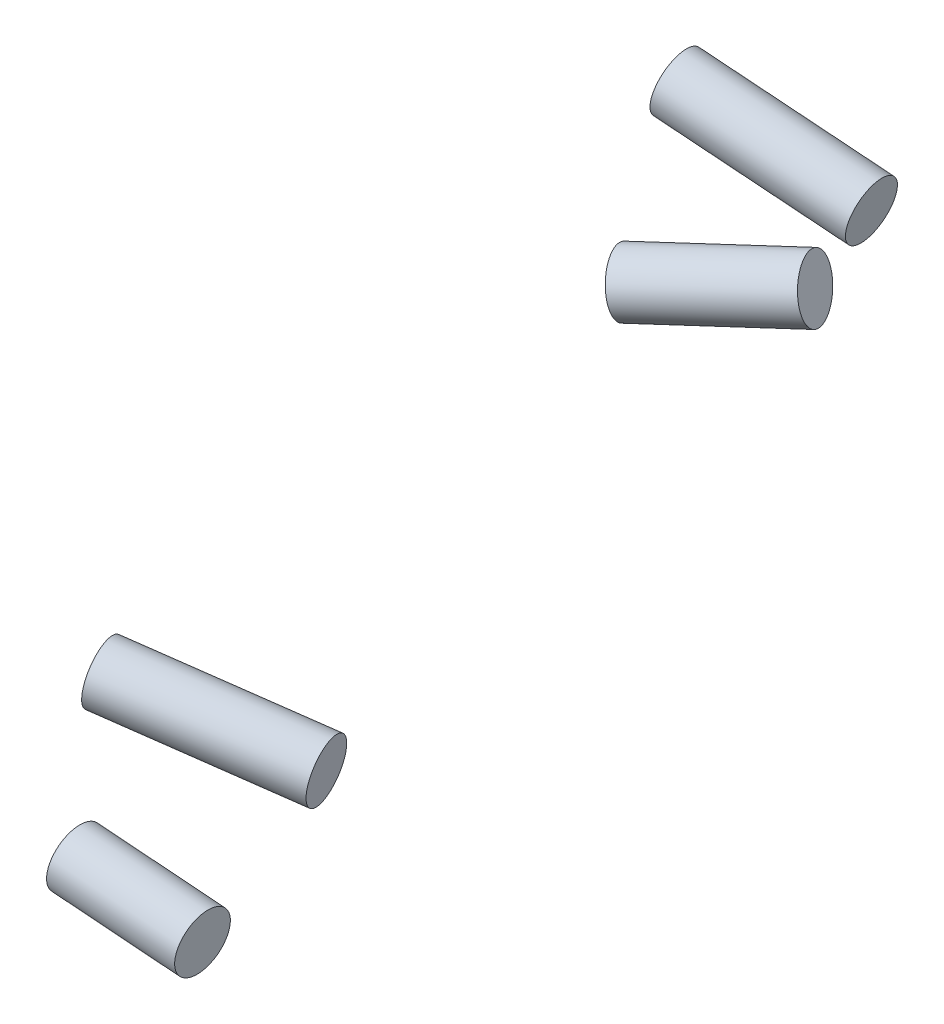
ISO-10303-21;
HEADER;
FILE_DESCRIPTION(('STEP AP214'),'2;1');
FILE_NAME('part.step','',(''),(''),'','','');
FILE_SCHEMA(('AUTOMOTIVE_DESIGN { 1 0 10303 214 1 1 1 1 }'));
ENDSEC;
DATA;
#1=APPLICATION_CONTEXT('core data for automotive mechanical design processes');
#2=APPLICATION_PROTOCOL_DEFINITION('international standard','automotive_design',2000,#1);
#3=PRODUCT_CONTEXT('',#1,'mechanical');
#4=PRODUCT('Part','Part','',(#3));
#5=PRODUCT_RELATED_PRODUCT_CATEGORY('part','',(#4));
#6=PRODUCT_DEFINITION_FORMATION('','',#4);
#7=PRODUCT_DEFINITION_CONTEXT('part definition',#1,'design');
#8=PRODUCT_DEFINITION('design','',#6,#7);
#9=PRODUCT_DEFINITION_SHAPE('','',#8);
#10=(LENGTH_UNIT() NAMED_UNIT(*) SI_UNIT(.MILLI.,.METRE.));
#11=(NAMED_UNIT(*) PLANE_ANGLE_UNIT() SI_UNIT($,.RADIAN.));
#12=(NAMED_UNIT(*) SI_UNIT($,.STERADIAN.) SOLID_ANGLE_UNIT());
#13=UNCERTAINTY_MEASURE_WITH_UNIT(LENGTH_MEASURE(1.E-05),#10,'distance_accuracy_value','');
#14=(GEOMETRIC_REPRESENTATION_CONTEXT(3) GLOBAL_UNCERTAINTY_ASSIGNED_CONTEXT((#13)) GLOBAL_UNIT_ASSIGNED_CONTEXT((#10,
#11,#12)) REPRESENTATION_CONTEXT('',''));
#15=CARTESIAN_POINT('',(0.,0.,0.));
#16=DIRECTION('',(0.,0.,1.));
#17=DIRECTION('',(1.,0.,0.));
#18=AXIS2_PLACEMENT_3D('',#15,#16,#17);
#19=CARTESIAN_POINT('',(166.026177,-30.2321009,-464.318765));
#20=DIRECTION('',(0.89786021332966,0.222717447003682,-0.379794649935699));
#21=DIRECTION('',(-0.389579708465379,0.,-0.920992752822751));
#22=AXIS2_PLACEMENT_3D('',#19,#20,#21);
#23=PLANE('',#22);
#24=CARTESIAN_POINT('',(166.026177,-30.2321009,-464.318765));
#25=DIRECTION('',(0.89786021332966,0.222717447003682,-0.379794649935699));
#26=DIRECTION('',(-0.389579708465379,0.,-0.920992752822751));
#27=AXIS2_PLACEMENT_3D('',#24,#25,#26);
#28=CIRCLE('',#27,6.99999999999999);
#29=CARTESIAN_POINT('',(163.299119040743,-30.2321009,-470.765714269759));
#30=VERTEX_POINT('',#29);
#31=EDGE_CURVE('E80',#30,#30,#28,.T.);
#32=ORIENTED_EDGE('',*,*,#31,.F.);
#33=EDGE_LOOP('',(#32));
#34=FACE_BOUND('',#33,.T.);
#35=ADVANCED_FACE('F74',(#34),#23,.F.);
#36=CARTESIAN_POINT('',(198.557411,-22.1626116,-478.079469));
#37=DIRECTION('',(0.89786021332966,0.222717447003682,-0.379794649935699));
#38=DIRECTION('',(-0.389579708465379,0.,-0.920992752822751));
#39=AXIS2_PLACEMENT_3D('',#36,#37,#38);
#40=PLANE('',#39);
#41=CARTESIAN_POINT('',(198.557411,-22.1626116,-478.079469));
#42=DIRECTION('',(0.89786021332966,0.222717447003682,-0.379794649935699));
#43=DIRECTION('',(-0.389579708465379,0.,-0.920992752822751));
#44=AXIS2_PLACEMENT_3D('',#41,#42,#43);
#45=CIRCLE('',#44,6.99999999999999);
#46=CARTESIAN_POINT('',(195.830353040742,-22.1626116,-484.526418269759));
#47=VERTEX_POINT('',#46);
#48=EDGE_CURVE('E12',#47,#47,#45,.T.);
#49=ORIENTED_EDGE('',*,*,#48,.T.);
#50=EDGE_LOOP('',(#49));
#51=FACE_BOUND('',#50,.T.);
#52=ADVANCED_FACE('F89',(#51),#40,.T.);
#53=CARTESIAN_POINT('',(166.026177,-30.2321009,-464.318765));
#54=DIRECTION('',(0.89786021332966,0.222717447003683,-0.379794649935698));
#55=DIRECTION('',(-0.389579708465379,0.,-0.920992752822752));
#56=AXIS2_PLACEMENT_3D('',#53,#54,#55);
#57=CYLINDRICAL_SURFACE('',#56,6.99999999999999);
#58=ORIENTED_EDGE('',*,*,#48,.F.);
#59=EDGE_LOOP('',(#58));
#60=FACE_BOUND('',#59,.T.);
#61=ORIENTED_EDGE('',*,*,#31,.T.);
#62=EDGE_LOOP('',(#61));
#63=FACE_BOUND('',#62,.T.);
#64=ADVANCED_FACE('F86',(#60,#63),#57,.T.);
#65=CLOSED_SHELL('',(#35,#52,#64));
#66=MANIFOLD_SOLID_BREP('B2',#65);
#67=CARTESIAN_POINT('',(164.805861,4.04738961000001,-478.324842));
#68=DIRECTION('',(0.971273965039373,-0.203382569261322,-0.123541148437916));
#69=DIRECTION('',(0.204952618983025,0.978771895781647,0.));
#70=AXIS2_PLACEMENT_3D('',#67,#68,#69);
#71=PLANE('',#70);
#72=CARTESIAN_POINT('',(164.805861,4.04738961000001,-478.324842));
#73=DIRECTION('',(0.971273965039373,-0.203382569261322,-0.123541148437916));
#74=DIRECTION('',(0.204952618983025,0.978771895781647,0.));
#75=AXIS2_PLACEMENT_3D('',#72,#73,#74);
#76=CIRCLE('',#75,7.00000000000002);
#77=CARTESIAN_POINT('',(166.240529332881,10.8987928804716,-478.324842));
#78=VERTEX_POINT('',#77);
#79=EDGE_CURVE('E141',#78,#78,#76,.T.);
#80=ORIENTED_EDGE('',*,*,#79,.F.);
#81=EDGE_LOOP('',(#80));
#82=FACE_BOUND('',#81,.T.);
#83=ADVANCED_FACE('F135',(#82),#71,.F.);
#84=CARTESIAN_POINT('',(206.559789,-4.69578837999999,-483.635731));
#85=DIRECTION('',(0.971273965039373,-0.203382569261322,-0.123541148437916));
#86=DIRECTION('',(0.204952618983025,0.978771895781647,0.));
#87=AXIS2_PLACEMENT_3D('',#84,#85,#86);
#88=PLANE('',#87);
#89=CARTESIAN_POINT('',(206.559789,-4.69578837999999,-483.635731));
#90=DIRECTION('',(0.971273965039373,-0.203382569261322,-0.123541148437916));
#91=DIRECTION('',(0.204952618983025,0.978771895781647,0.));
#92=AXIS2_PLACEMENT_3D('',#89,#90,#91);
#93=CIRCLE('',#92,7.00000000000002);
#94=CARTESIAN_POINT('',(207.994457332881,2.15561489047157,-483.635731));
#95=VERTEX_POINT('',#94);
#96=EDGE_CURVE('E73',#95,#95,#93,.T.);
#97=ORIENTED_EDGE('',*,*,#96,.T.);
#98=EDGE_LOOP('',(#97));
#99=FACE_BOUND('',#98,.T.);
#100=ADVANCED_FACE('F150',(#99),#88,.T.);
#101=CARTESIAN_POINT('',(164.805861,4.04738961000001,-478.324842));
#102=DIRECTION('',(0.971273965039373,-0.203382569261323,-0.123541148437915));
#103=DIRECTION('',(0.204952618983025,0.978771895781647,0.));
#104=AXIS2_PLACEMENT_3D('',#101,#102,#103);
#105=CYLINDRICAL_SURFACE('',#104,7.00000000000002);
#106=ORIENTED_EDGE('',*,*,#96,.F.);
#107=EDGE_LOOP('',(#106));
#108=FACE_BOUND('',#107,.T.);
#109=ORIENTED_EDGE('',*,*,#79,.T.);
#110=EDGE_LOOP('',(#109));
#111=FACE_BOUND('',#110,.T.);
#112=ADVANCED_FACE('F147',(#108,#111),#105,.T.);
#113=CLOSED_SHELL('',(#83,#100,#112));
#114=MANIFOLD_SOLID_BREP('B7',#113);
#115=CARTESIAN_POINT('',(253.16093,3.06062272,-245.112504));
#116=DIRECTION('',(0.990573329465155,-0.127894374356964,-0.0490663628176999));
#117=DIRECTION('',(0.128048606260967,0.991767893428006,0.));
#118=AXIS2_PLACEMENT_3D('',#115,#116,#117);
#119=PLANE('',#118);
#120=CARTESIAN_POINT('',(253.16093,3.06062272,-245.112504));
#121=DIRECTION('',(0.990573329465155,-0.127894374356964,-0.0490663628176999));
#122=DIRECTION('',(0.128048606260967,0.991767893428006,0.));
#123=AXIS2_PLACEMENT_3D('',#120,#121,#122);
#124=CIRCLE('',#123,7.00000000000001);
#125=CARTESIAN_POINT('',(254.057270243827,10.0029979739961,-245.112504));
#126=VERTEX_POINT('',#125);
#127=EDGE_CURVE('E201',#126,#126,#124,.T.);
#128=ORIENTED_EDGE('',*,*,#127,.F.);
#129=EDGE_LOOP('',(#128));
#130=FACE_BOUND('',#129,.T.);
#131=ADVANCED_FACE('F195',(#130),#119,.F.);
#132=CARTESIAN_POINT('',(282.547385,-0.733505554000008,-246.568112));
#133=DIRECTION('',(0.990573329465155,-0.127894374356964,-0.0490663628176999));
#134=DIRECTION('',(0.128048606260967,0.991767893428006,0.));
#135=AXIS2_PLACEMENT_3D('',#132,#133,#134);
#136=PLANE('',#135);
#137=CARTESIAN_POINT('',(282.547385,-0.733505554000008,-246.568112));
#138=DIRECTION('',(0.990573329465155,-0.127894374356964,-0.0490663628176999));
#139=DIRECTION('',(0.128048606260967,0.991767893428006,0.));
#140=AXIS2_PLACEMENT_3D('',#137,#138,#139);
#141=CIRCLE('',#140,7.00000000000001);
#142=CARTESIAN_POINT('',(283.443725243827,6.20886969999604,-246.568112));
#143=VERTEX_POINT('',#142);
#144=EDGE_CURVE('E134',#143,#143,#141,.T.);
#145=ORIENTED_EDGE('',*,*,#144,.T.);
#146=EDGE_LOOP('',(#145));
#147=FACE_BOUND('',#146,.T.);
#148=ADVANCED_FACE('F210',(#147),#136,.T.);
#149=CARTESIAN_POINT('',(253.16093,3.06062272,-245.112504));
#150=DIRECTION('',(0.990573329465155,-0.127894374356964,-0.0490663628177034));
#151=DIRECTION('',(0.128048606260967,0.991767893428006,0.));
#152=AXIS2_PLACEMENT_3D('',#149,#150,#151);
#153=CYLINDRICAL_SURFACE('',#152,7.00000000000001);
#154=ORIENTED_EDGE('',*,*,#144,.F.);
#155=EDGE_LOOP('',(#154));
#156=FACE_BOUND('',#155,.T.);
#157=ORIENTED_EDGE('',*,*,#127,.T.);
#158=EDGE_LOOP('',(#157));
#159=FACE_BOUND('',#158,.T.);
#160=ADVANCED_FACE('F207',(#156,#159),#153,.T.);
#161=CLOSED_SHELL('',(#131,#148,#160));
#162=MANIFOLD_SOLID_BREP('B68',#161);
#163=CARTESIAN_POINT('',(258.30426,43.4708888,-246.608444));
#164=DIRECTION('',(0.951812297367077,-0.131402641187734,-0.277104125681476));
#165=DIRECTION('',(-0.279527889503172,0.,-0.960137572949784));
#166=AXIS2_PLACEMENT_3D('',#163,#164,#165);
#167=PLANE('',#166);
#168=CARTESIAN_POINT('',(258.30426,43.4708888,-246.608444));
#169=DIRECTION('',(0.951812297367077,-0.131402641187734,-0.277104125681476));
#170=DIRECTION('',(-0.279527889503172,0.,-0.960137572949784));
#171=AXIS2_PLACEMENT_3D('',#168,#169,#170);
#172=CIRCLE('',#171,7.);
#173=CARTESIAN_POINT('',(256.347564773478,43.4708888,-253.329407010648));
#174=VERTEX_POINT('',#173);
#175=EDGE_CURVE('E254',#174,#174,#172,.T.);
#176=ORIENTED_EDGE('',*,*,#175,.F.);
#177=EDGE_LOOP('',(#176));
#178=FACE_BOUND('',#177,.T.);
#179=ADVANCED_FACE('F248',(#178),#167,.F.);
#180=CARTESIAN_POINT('',(300.152615,37.6935056,-258.791888));
#181=DIRECTION('',(0.951812297367077,-0.131402641187734,-0.277104125681476));
#182=DIRECTION('',(-0.279527889503172,0.,-0.960137572949784));
#183=AXIS2_PLACEMENT_3D('',#180,#181,#182);
#184=PLANE('',#183);
#185=CARTESIAN_POINT('',(300.152615,37.6935056,-258.791888));
#186=DIRECTION('',(0.951812297367077,-0.131402641187734,-0.277104125681476));
#187=DIRECTION('',(-0.279527889503172,0.,-0.960137572949784));
#188=AXIS2_PLACEMENT_3D('',#185,#186,#187);
#189=CIRCLE('',#188,7.);
#190=CARTESIAN_POINT('',(298.195919773478,37.6935056,-265.512851010648));
#191=VERTEX_POINT('',#190);
#192=EDGE_CURVE('E194',#191,#191,#189,.T.);
#193=ORIENTED_EDGE('',*,*,#192,.T.);
#194=EDGE_LOOP('',(#193));
#195=FACE_BOUND('',#194,.T.);
#196=ADVANCED_FACE('F263',(#195),#184,.T.);
#197=CARTESIAN_POINT('',(258.30426,43.4708888,-246.608444));
#198=DIRECTION('',(0.951812297367076,-0.131402641187735,-0.277104125681479));
#199=DIRECTION('',(-0.279527889503174,0.,-0.960137572949784));
#200=AXIS2_PLACEMENT_3D('',#197,#198,#199);
#201=CYLINDRICAL_SURFACE('',#200,7.);
#202=ORIENTED_EDGE('',*,*,#192,.F.);
#203=EDGE_LOOP('',(#202));
#204=FACE_BOUND('',#203,.T.);
#205=ORIENTED_EDGE('',*,*,#175,.T.);
#206=EDGE_LOOP('',(#205));
#207=FACE_BOUND('',#206,.T.);
#208=ADVANCED_FACE('F260',(#204,#207),#201,.T.);
#209=CLOSED_SHELL('',(#179,#196,#208));
#210=MANIFOLD_SOLID_BREP('B129',#209);
#211=ADVANCED_BREP_SHAPE_REPRESENTATION('',(#18,#66,#114,#162,#210),#14);
#212=SHAPE_DEFINITION_REPRESENTATION(#9,#211);
ENDSEC;
END-ISO-10303-21;
